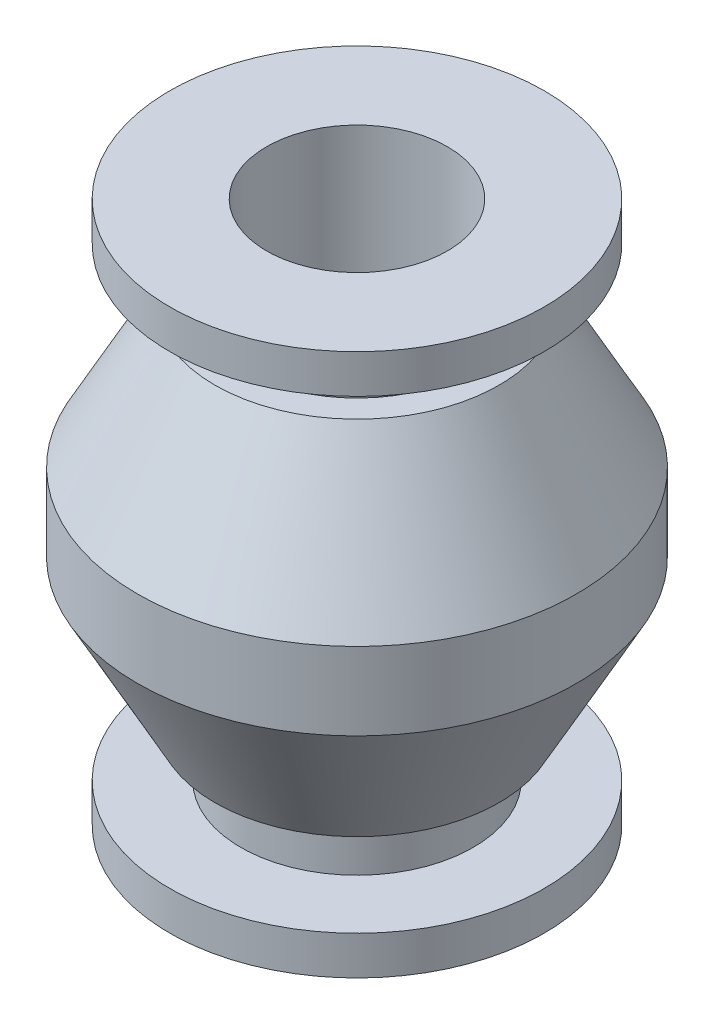
ISO-10303-21;
HEADER;
FILE_DESCRIPTION(('STEP AP214'),'2;1');
FILE_NAME('part.step','',(''),(''),'','','');
FILE_SCHEMA(('AUTOMOTIVE_DESIGN { 1 0 10303 214 1 1 1 1 }'));
ENDSEC;
DATA;
#1=APPLICATION_CONTEXT('core data for automotive mechanical design processes');
#2=APPLICATION_PROTOCOL_DEFINITION('international standard','automotive_design',2000,#1);
#3=PRODUCT_CONTEXT('',#1,'mechanical');
#4=PRODUCT('Part','Part','',(#3));
#5=PRODUCT_RELATED_PRODUCT_CATEGORY('part','',(#4));
#6=PRODUCT_DEFINITION_FORMATION('','',#4);
#7=PRODUCT_DEFINITION_CONTEXT('part definition',#1,'design');
#8=PRODUCT_DEFINITION('design','',#6,#7);
#9=PRODUCT_DEFINITION_SHAPE('','',#8);
#10=(LENGTH_UNIT() NAMED_UNIT(*) SI_UNIT(.MILLI.,.METRE.));
#11=(NAMED_UNIT(*) PLANE_ANGLE_UNIT() SI_UNIT($,.RADIAN.));
#12=(NAMED_UNIT(*) SI_UNIT($,.STERADIAN.) SOLID_ANGLE_UNIT());
#13=UNCERTAINTY_MEASURE_WITH_UNIT(LENGTH_MEASURE(1.E-05),#10,'distance_accuracy_value','');
#14=(GEOMETRIC_REPRESENTATION_CONTEXT(3) GLOBAL_UNCERTAINTY_ASSIGNED_CONTEXT((#13)) GLOBAL_UNIT_ASSIGNED_CONTEXT((#10,
#11,#12)) REPRESENTATION_CONTEXT('',''));
#15=CARTESIAN_POINT('',(0.,0.,0.));
#16=DIRECTION('',(0.,0.,1.));
#17=DIRECTION('',(1.,0.,0.));
#18=AXIS2_PLACEMENT_3D('',#15,#16,#17);
#19=CARTESIAN_POINT('',(-3.5,10.5,0.));
#20=DIRECTION('',(0.,-1.,0.));
#21=DIRECTION('',(0.,0.,-1.));
#22=AXIS2_PLACEMENT_3D('',#19,#20,#21);
#23=PLANE('',#22);
#24=CARTESIAN_POINT('',(0.,10.5,0.));
#25=DIRECTION('',(0.,-1.,0.));
#26=DIRECTION('',(0.,0.,-1.));
#27=AXIS2_PLACEMENT_3D('',#24,#25,#26);
#28=CIRCLE('',#27,7.25);
#29=CARTESIAN_POINT('',(0.,10.5,-7.25));
#30=VERTEX_POINT('',#29);
#31=EDGE_CURVE('E10',#30,#30,#28,.T.);
#32=ORIENTED_EDGE('',*,*,#31,.F.);
#33=EDGE_LOOP('',(#32));
#34=FACE_BOUND('',#33,.T.);
#35=CARTESIAN_POINT('',(0.,10.5,0.));
#36=DIRECTION('',(0.,-1.,0.));
#37=DIRECTION('',(0.,0.,-1.));
#38=AXIS2_PLACEMENT_3D('',#35,#36,#37);
#39=CIRCLE('',#38,3.5);
#40=CARTESIAN_POINT('',(0.,10.5,-3.5));
#41=VERTEX_POINT('',#40);
#42=EDGE_CURVE('E77',#41,#41,#39,.T.);
#43=ORIENTED_EDGE('',*,*,#42,.T.);
#44=EDGE_LOOP('',(#43));
#45=FACE_BOUND('',#44,.T.);
#46=ADVANCED_FACE('F31',(#34,#45),#23,.F.);
#47=CARTESIAN_POINT('',(0.,0.,0.));
#48=DIRECTION('',(0.,-1.,0.));
#49=DIRECTION('',(0.,0.,-1.));
#50=AXIS2_PLACEMENT_3D('',#47,#48,#49);
#51=CYLINDRICAL_SURFACE('',#50,7.25);
#52=CARTESIAN_POINT('',(0.,9.,0.));
#53=DIRECTION('',(0.,-1.,0.));
#54=DIRECTION('',(0.,0.,-1.));
#55=AXIS2_PLACEMENT_3D('',#52,#53,#54);
#56=CIRCLE('',#55,7.25);
#57=CARTESIAN_POINT('',(0.,9.,-7.25));
#58=VERTEX_POINT('',#57);
#59=EDGE_CURVE('E37',#58,#58,#56,.T.);
#60=ORIENTED_EDGE('',*,*,#59,.F.);
#61=EDGE_LOOP('',(#60));
#62=FACE_BOUND('',#61,.T.);
#63=ORIENTED_EDGE('',*,*,#31,.T.);
#64=EDGE_LOOP('',(#63));
#65=FACE_BOUND('',#64,.T.);
#66=ADVANCED_FACE('F150',(#62,#65),#51,.T.);
#67=CARTESIAN_POINT('',(-7.25,9.,0.));
#68=DIRECTION('',(0.,1.,0.));
#69=DIRECTION('',(0.,0.,1.));
#70=AXIS2_PLACEMENT_3D('',#67,#68,#69);
#71=PLANE('',#70);
#72=CARTESIAN_POINT('',(0.,9.,0.));
#73=DIRECTION('',(0.,-1.,0.));
#74=DIRECTION('',(0.,0.,-1.));
#75=AXIS2_PLACEMENT_3D('',#72,#73,#74);
#76=CIRCLE('',#75,4.5);
#77=CARTESIAN_POINT('',(0.,9.,-4.5));
#78=VERTEX_POINT('',#77);
#79=EDGE_CURVE('E41',#78,#78,#76,.T.);
#80=ORIENTED_EDGE('',*,*,#79,.F.);
#81=EDGE_LOOP('',(#80));
#82=FACE_BOUND('',#81,.T.);
#83=ORIENTED_EDGE('',*,*,#59,.T.);
#84=EDGE_LOOP('',(#83));
#85=FACE_BOUND('',#84,.T.);
#86=ADVANCED_FACE('F145',(#82,#85),#71,.F.);
#87=CARTESIAN_POINT('',(0.,0.,0.));
#88=DIRECTION('',(0.,-1.,0.));
#89=DIRECTION('',(0.,0.,-1.));
#90=AXIS2_PLACEMENT_3D('',#87,#88,#89);
#91=CYLINDRICAL_SURFACE('',#90,4.5);
#92=CARTESIAN_POINT('',(0.,7.,0.));
#93=DIRECTION('',(0.,-1.,0.));
#94=DIRECTION('',(0.,0.,-1.));
#95=AXIS2_PLACEMENT_3D('',#92,#93,#94);
#96=CIRCLE('',#95,4.5);
#97=CARTESIAN_POINT('',(0.,7.,-4.5));
#98=VERTEX_POINT('',#97);
#99=EDGE_CURVE('E45',#98,#98,#96,.T.);
#100=ORIENTED_EDGE('',*,*,#99,.F.);
#101=EDGE_LOOP('',(#100));
#102=FACE_BOUND('',#101,.T.);
#103=ORIENTED_EDGE('',*,*,#79,.T.);
#104=EDGE_LOOP('',(#103));
#105=FACE_BOUND('',#104,.T.);
#106=ADVANCED_FACE('F139',(#102,#105),#91,.T.);
#107=CARTESIAN_POINT('',(-4.5,7.,0.));
#108=DIRECTION('',(0.,-1.,0.));
#109=DIRECTION('',(0.,0.,-1.));
#110=AXIS2_PLACEMENT_3D('',#107,#108,#109);
#111=PLANE('',#110);
#112=CARTESIAN_POINT('',(0.,7.,0.));
#113=DIRECTION('',(0.,-1.,0.));
#114=DIRECTION('',(0.,0.,-1.));
#115=AXIS2_PLACEMENT_3D('',#112,#113,#114);
#116=CIRCLE('',#115,5.5);
#117=CARTESIAN_POINT('',(0.,7.,-5.5));
#118=VERTEX_POINT('',#117);
#119=EDGE_CURVE('E50',#118,#118,#116,.T.);
#120=ORIENTED_EDGE('',*,*,#119,.F.);
#121=EDGE_LOOP('',(#120));
#122=FACE_BOUND('',#121,.T.);
#123=ORIENTED_EDGE('',*,*,#99,.T.);
#124=EDGE_LOOP('',(#123));
#125=FACE_BOUND('',#124,.T.);
#126=ADVANCED_FACE('F133',(#122,#125),#111,.F.);
#127=CARTESIAN_POINT('',(0.,7.,0.));
#128=DIRECTION('',(0.,-1.,0.));
#129=DIRECTION('',(0.,0.,-1.));
#130=AXIS2_PLACEMENT_3D('',#127,#128,#129);
#131=CONICAL_SURFACE('',#130,5.5,0.49934672168013);
#132=CARTESIAN_POINT('',(0.,1.5,0.));
#133=DIRECTION('',(0.,-1.,0.));
#134=DIRECTION('',(0.,0.,-1.));
#135=AXIS2_PLACEMENT_3D('',#132,#133,#134);
#136=CIRCLE('',#135,8.5);
#137=CARTESIAN_POINT('',(0.,1.5,-8.5));
#138=VERTEX_POINT('',#137);
#139=EDGE_CURVE('E53',#138,#138,#136,.T.);
#140=ORIENTED_EDGE('',*,*,#139,.F.);
#141=EDGE_LOOP('',(#140));
#142=FACE_BOUND('',#141,.T.);
#143=ORIENTED_EDGE('',*,*,#119,.T.);
#144=EDGE_LOOP('',(#143));
#145=FACE_BOUND('',#144,.T.);
#146=ADVANCED_FACE('F127',(#142,#145),#131,.T.);
#147=CARTESIAN_POINT('',(0.,0.,0.));
#148=DIRECTION('',(0.,-1.,0.));
#149=DIRECTION('',(0.,0.,-1.));
#150=AXIS2_PLACEMENT_3D('',#147,#148,#149);
#151=CYLINDRICAL_SURFACE('',#150,8.5);
#152=CARTESIAN_POINT('',(0.,-1.5,0.));
#153=DIRECTION('',(0.,-1.,0.));
#154=DIRECTION('',(0.,0.,-1.));
#155=AXIS2_PLACEMENT_3D('',#152,#153,#154);
#156=CIRCLE('',#155,8.5);
#157=CARTESIAN_POINT('',(0.,-1.5,-8.5));
#158=VERTEX_POINT('',#157);
#159=EDGE_CURVE('E56',#158,#158,#156,.T.);
#160=ORIENTED_EDGE('',*,*,#159,.F.);
#161=EDGE_LOOP('',(#160));
#162=FACE_BOUND('',#161,.T.);
#163=ORIENTED_EDGE('',*,*,#139,.T.);
#164=EDGE_LOOP('',(#163));
#165=FACE_BOUND('',#164,.T.);
#166=ADVANCED_FACE('F121',(#162,#165),#151,.T.);
#167=CARTESIAN_POINT('',(0.,-1.5,0.));
#168=DIRECTION('',(0.,1.,0.));
#169=DIRECTION('',(0.,0.,1.));
#170=AXIS2_PLACEMENT_3D('',#167,#168,#169);
#171=CONICAL_SURFACE('',#170,8.5,0.49934672168013);
#172=CARTESIAN_POINT('',(0.,-7.,0.));
#173=DIRECTION('',(0.,-1.,0.));
#174=DIRECTION('',(0.,0.,-1.));
#175=AXIS2_PLACEMENT_3D('',#172,#173,#174);
#176=CIRCLE('',#175,5.5);
#177=CARTESIAN_POINT('',(0.,-7.,-5.5));
#178=VERTEX_POINT('',#177);
#179=EDGE_CURVE('E59',#178,#178,#176,.T.);
#180=ORIENTED_EDGE('',*,*,#179,.F.);
#181=EDGE_LOOP('',(#180));
#182=FACE_BOUND('',#181,.T.);
#183=ORIENTED_EDGE('',*,*,#159,.T.);
#184=EDGE_LOOP('',(#183));
#185=FACE_BOUND('',#184,.T.);
#186=ADVANCED_FACE('F115',(#182,#185),#171,.T.);
#187=CARTESIAN_POINT('',(-4.5,-7.,0.));
#188=DIRECTION('',(0.,1.,0.));
#189=DIRECTION('',(0.,0.,1.));
#190=AXIS2_PLACEMENT_3D('',#187,#188,#189);
#191=PLANE('',#190);
#192=CARTESIAN_POINT('',(0.,-7.,0.));
#193=DIRECTION('',(0.,-1.,0.));
#194=DIRECTION('',(0.,0.,-1.));
#195=AXIS2_PLACEMENT_3D('',#192,#193,#194);
#196=CIRCLE('',#195,4.5);
#197=CARTESIAN_POINT('',(0.,-7.,-4.5));
#198=VERTEX_POINT('',#197);
#199=EDGE_CURVE('E62',#198,#198,#196,.T.);
#200=ORIENTED_EDGE('',*,*,#199,.F.);
#201=EDGE_LOOP('',(#200));
#202=FACE_BOUND('',#201,.T.);
#203=ORIENTED_EDGE('',*,*,#179,.T.);
#204=EDGE_LOOP('',(#203));
#205=FACE_BOUND('',#204,.T.);
#206=ADVANCED_FACE('F109',(#202,#205),#191,.F.);
#207=CARTESIAN_POINT('',(0.,0.,0.));
#208=DIRECTION('',(0.,-1.,0.));
#209=DIRECTION('',(0.,0.,-1.));
#210=AXIS2_PLACEMENT_3D('',#207,#208,#209);
#211=CYLINDRICAL_SURFACE('',#210,4.5);
#212=CARTESIAN_POINT('',(0.,-9.,0.));
#213=DIRECTION('',(0.,-1.,0.));
#214=DIRECTION('',(0.,0.,-1.));
#215=AXIS2_PLACEMENT_3D('',#212,#213,#214);
#216=CIRCLE('',#215,4.5);
#217=CARTESIAN_POINT('',(0.,-9.,-4.5));
#218=VERTEX_POINT('',#217);
#219=EDGE_CURVE('E65',#218,#218,#216,.T.);
#220=ORIENTED_EDGE('',*,*,#219,.F.);
#221=EDGE_LOOP('',(#220));
#222=FACE_BOUND('',#221,.T.);
#223=ORIENTED_EDGE('',*,*,#199,.T.);
#224=EDGE_LOOP('',(#223));
#225=FACE_BOUND('',#224,.T.);
#226=ADVANCED_FACE('F103',(#222,#225),#211,.T.);
#227=CARTESIAN_POINT('',(-7.25,-9.,0.));
#228=DIRECTION('',(0.,-1.,0.));
#229=DIRECTION('',(0.,0.,-1.));
#230=AXIS2_PLACEMENT_3D('',#227,#228,#229);
#231=PLANE('',#230);
#232=CARTESIAN_POINT('',(0.,-9.,0.));
#233=DIRECTION('',(0.,-1.,0.));
#234=DIRECTION('',(0.,0.,-1.));
#235=AXIS2_PLACEMENT_3D('',#232,#233,#234);
#236=CIRCLE('',#235,7.25);
#237=CARTESIAN_POINT('',(0.,-9.,-7.25));
#238=VERTEX_POINT('',#237);
#239=EDGE_CURVE('E68',#238,#238,#236,.T.);
#240=ORIENTED_EDGE('',*,*,#239,.F.);
#241=EDGE_LOOP('',(#240));
#242=FACE_BOUND('',#241,.T.);
#243=ORIENTED_EDGE('',*,*,#219,.T.);
#244=EDGE_LOOP('',(#243));
#245=FACE_BOUND('',#244,.T.);
#246=ADVANCED_FACE('F97',(#242,#245),#231,.F.);
#247=CARTESIAN_POINT('',(0.,0.,0.));
#248=DIRECTION('',(0.,-1.,0.));
#249=DIRECTION('',(0.,0.,-1.));
#250=AXIS2_PLACEMENT_3D('',#247,#248,#249);
#251=CYLINDRICAL_SURFACE('',#250,7.25);
#252=CARTESIAN_POINT('',(0.,-10.5,0.));
#253=DIRECTION('',(0.,-1.,0.));
#254=DIRECTION('',(0.,0.,-1.));
#255=AXIS2_PLACEMENT_3D('',#252,#253,#254);
#256=CIRCLE('',#255,7.25);
#257=CARTESIAN_POINT('',(0.,-10.5,-7.25));
#258=VERTEX_POINT('',#257);
#259=EDGE_CURVE('E71',#258,#258,#256,.T.);
#260=ORIENTED_EDGE('',*,*,#259,.F.);
#261=EDGE_LOOP('',(#260));
#262=FACE_BOUND('',#261,.T.);
#263=ORIENTED_EDGE('',*,*,#239,.T.);
#264=EDGE_LOOP('',(#263));
#265=FACE_BOUND('',#264,.T.);
#266=ADVANCED_FACE('F91',(#262,#265),#251,.T.);
#267=CARTESIAN_POINT('',(-3.5,-10.5,0.));
#268=DIRECTION('',(0.,1.,0.));
#269=DIRECTION('',(0.,0.,1.));
#270=AXIS2_PLACEMENT_3D('',#267,#268,#269);
#271=PLANE('',#270);
#272=CARTESIAN_POINT('',(0.,-10.5,0.));
#273=DIRECTION('',(0.,-1.,0.));
#274=DIRECTION('',(0.,0.,-1.));
#275=AXIS2_PLACEMENT_3D('',#272,#273,#274);
#276=CIRCLE('',#275,3.5);
#277=CARTESIAN_POINT('',(0.,-10.5,-3.5));
#278=VERTEX_POINT('',#277);
#279=EDGE_CURVE('E74',#278,#278,#276,.T.);
#280=ORIENTED_EDGE('',*,*,#279,.F.);
#281=EDGE_LOOP('',(#280));
#282=FACE_BOUND('',#281,.T.);
#283=ORIENTED_EDGE('',*,*,#259,.T.);
#284=EDGE_LOOP('',(#283));
#285=FACE_BOUND('',#284,.T.);
#286=ADVANCED_FACE('F85',(#282,#285),#271,.F.);
#287=CARTESIAN_POINT('',(0.,0.,0.));
#288=DIRECTION('',(0.,-1.,0.));
#289=DIRECTION('',(0.,0.,-1.));
#290=AXIS2_PLACEMENT_3D('',#287,#288,#289);
#291=CYLINDRICAL_SURFACE('',#290,3.5);
#292=ORIENTED_EDGE('',*,*,#42,.F.);
#293=EDGE_LOOP('',(#292));
#294=FACE_BOUND('',#293,.T.);
#295=ORIENTED_EDGE('',*,*,#279,.T.);
#296=EDGE_LOOP('',(#295));
#297=FACE_BOUND('',#296,.T.);
#298=ADVANCED_FACE('F82',(#294,#297),#291,.F.);
#299=CLOSED_SHELL('',(#46,#66,#86,#106,#126,#146,#166,#186,#206,#226,#246,#266,#286,#298));
#300=MANIFOLD_SOLID_BREP('B2',#299);
#301=ADVANCED_BREP_SHAPE_REPRESENTATION('',(#18,#300),#14);
#302=SHAPE_DEFINITION_REPRESENTATION(#9,#301);
ENDSEC;
END-ISO-10303-21;
